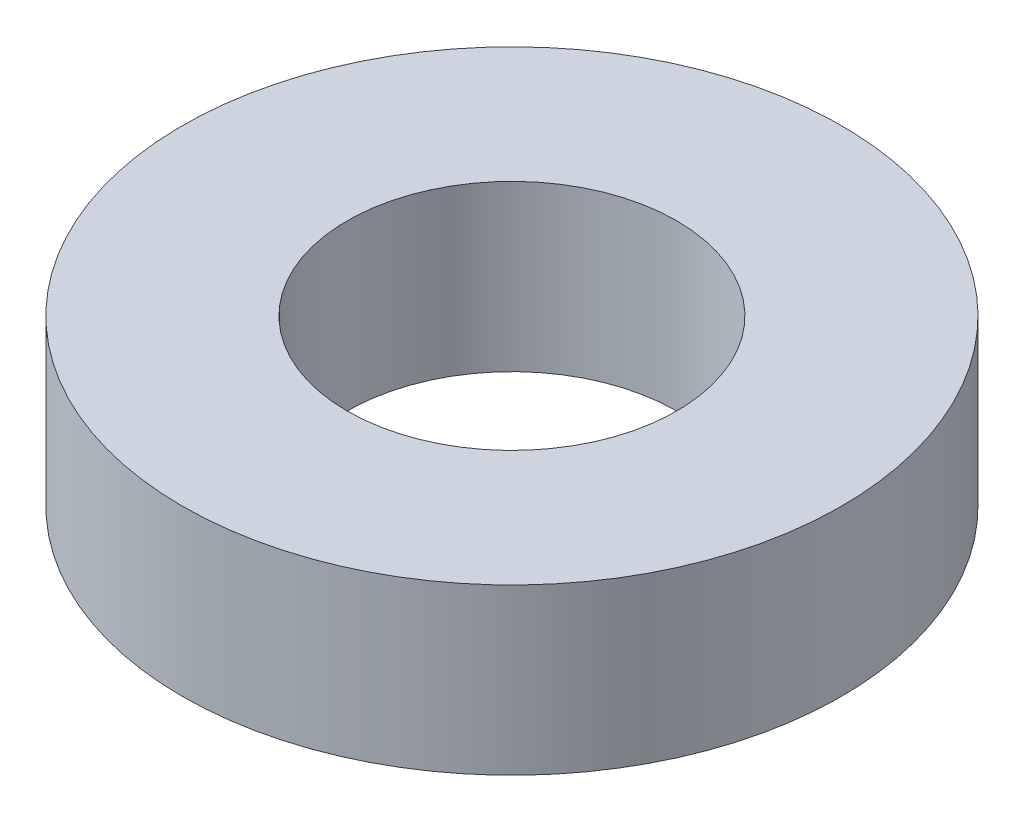
ISO-10303-21;
HEADER;
FILE_DESCRIPTION(('STEP AP214'),'2;1');
FILE_NAME('part.step','',(''),(''),'','','');
FILE_SCHEMA(('AUTOMOTIVE_DESIGN { 1 0 10303 214 1 1 1 1 }'));
ENDSEC;
DATA;
#1=APPLICATION_CONTEXT('core data for automotive mechanical design processes');
#2=APPLICATION_PROTOCOL_DEFINITION('international standard','automotive_design',2000,#1);
#3=PRODUCT_CONTEXT('',#1,'mechanical');
#4=PRODUCT('Part','Part','',(#3));
#5=PRODUCT_RELATED_PRODUCT_CATEGORY('part','',(#4));
#6=PRODUCT_DEFINITION_FORMATION('','',#4);
#7=PRODUCT_DEFINITION_CONTEXT('part definition',#1,'design');
#8=PRODUCT_DEFINITION('design','',#6,#7);
#9=PRODUCT_DEFINITION_SHAPE('','',#8);
#10=(LENGTH_UNIT() NAMED_UNIT(*) SI_UNIT(.MILLI.,.METRE.));
#11=(NAMED_UNIT(*) PLANE_ANGLE_UNIT() SI_UNIT($,.RADIAN.));
#12=(NAMED_UNIT(*) SI_UNIT($,.STERADIAN.) SOLID_ANGLE_UNIT());
#13=UNCERTAINTY_MEASURE_WITH_UNIT(LENGTH_MEASURE(1.E-05),#10,'distance_accuracy_value','');
#14=(GEOMETRIC_REPRESENTATION_CONTEXT(3) GLOBAL_UNCERTAINTY_ASSIGNED_CONTEXT((#13)) GLOBAL_UNIT_ASSIGNED_CONTEXT((#10,
#11,#12)) REPRESENTATION_CONTEXT('',''));
#15=CARTESIAN_POINT('',(0.,0.,0.));
#16=DIRECTION('',(0.,0.,1.));
#17=DIRECTION('',(1.,0.,0.));
#18=AXIS2_PLACEMENT_3D('',#15,#16,#17);
#19=CARTESIAN_POINT('',(0.,1.,0.));
#20=DIRECTION('',(0.,1.,0.));
#21=DIRECTION('',(0.,0.,1.));
#22=AXIS2_PLACEMENT_3D('',#19,#20,#21);
#23=PLANE('',#22);
#24=CARTESIAN_POINT('',(0.,1.,0.));
#25=DIRECTION('',(0.,1.,0.));
#26=DIRECTION('',(0.,0.,1.));
#27=AXIS2_PLACEMENT_3D('',#24,#25,#26);
#28=CIRCLE('',#27,4.);
#29=CARTESIAN_POINT('',(0.,1.,4.));
#30=VERTEX_POINT('',#29);
#31=EDGE_CURVE('E10',#30,#30,#28,.T.);
#32=ORIENTED_EDGE('',*,*,#31,.T.);
#33=EDGE_LOOP('',(#32));
#34=FACE_BOUND('',#33,.T.);
#35=CARTESIAN_POINT('',(0.,1.,0.));
#36=DIRECTION('',(0.,1.,0.));
#37=DIRECTION('',(0.,0.,1.));
#38=AXIS2_PLACEMENT_3D('',#35,#36,#37);
#39=CIRCLE('',#38,2.);
#40=CARTESIAN_POINT('',(0.,1.,2.));
#41=VERTEX_POINT('',#40);
#42=EDGE_CURVE('E50',#41,#41,#39,.T.);
#43=ORIENTED_EDGE('',*,*,#42,.F.);
#44=EDGE_LOOP('',(#43));
#45=FACE_BOUND('',#44,.T.);
#46=ADVANCED_FACE('F37',(#34,#45),#23,.T.);
#47=CARTESIAN_POINT('',(0.,-1.,0.));
#48=DIRECTION('',(0.,1.,0.));
#49=DIRECTION('',(0.,0.,1.));
#50=AXIS2_PLACEMENT_3D('',#47,#48,#49);
#51=PLANE('',#50);
#52=CARTESIAN_POINT('',(0.,-1.,0.));
#53=DIRECTION('',(0.,1.,0.));
#54=DIRECTION('',(0.,0.,1.));
#55=AXIS2_PLACEMENT_3D('',#52,#53,#54);
#56=CIRCLE('',#55,4.);
#57=CARTESIAN_POINT('',(0.,-1.,4.));
#58=VERTEX_POINT('',#57);
#59=EDGE_CURVE('E41',#58,#58,#56,.T.);
#60=ORIENTED_EDGE('',*,*,#59,.F.);
#61=EDGE_LOOP('',(#60));
#62=FACE_BOUND('',#61,.T.);
#63=CARTESIAN_POINT('',(0.,-1.,0.));
#64=DIRECTION('',(0.,1.,0.));
#65=DIRECTION('',(0.,0.,1.));
#66=AXIS2_PLACEMENT_3D('',#63,#64,#65);
#67=CIRCLE('',#66,2.);
#68=CARTESIAN_POINT('',(0.,-1.,2.));
#69=VERTEX_POINT('',#68);
#70=EDGE_CURVE('E52',#69,#69,#67,.T.);
#71=ORIENTED_EDGE('',*,*,#70,.T.);
#72=EDGE_LOOP('',(#71));
#73=FACE_BOUND('',#72,.T.);
#74=ADVANCED_FACE('F64',(#62,#73),#51,.F.);
#75=CARTESIAN_POINT('',(0.,1.,0.));
#76=DIRECTION('',(0.,-1.,0.));
#77=DIRECTION('',(0.,0.,-1.));
#78=AXIS2_PLACEMENT_3D('',#75,#76,#77);
#79=CYLINDRICAL_SURFACE('',#78,4.);
#80=ORIENTED_EDGE('',*,*,#31,.F.);
#81=EDGE_LOOP('',(#80));
#82=FACE_BOUND('',#81,.T.);
#83=ORIENTED_EDGE('',*,*,#59,.T.);
#84=EDGE_LOOP('',(#83));
#85=FACE_BOUND('',#84,.T.);
#86=ADVANCED_FACE('F39',(#82,#85),#79,.T.);
#87=CARTESIAN_POINT('',(0.,1.,0.));
#88=DIRECTION('',(0.,-1.,0.));
#89=DIRECTION('',(0.,0.,-1.));
#90=AXIS2_PLACEMENT_3D('',#87,#88,#89);
#91=CYLINDRICAL_SURFACE('',#90,2.);
#92=ORIENTED_EDGE('',*,*,#42,.T.);
#93=EDGE_LOOP('',(#92));
#94=FACE_BOUND('',#93,.T.);
#95=ORIENTED_EDGE('',*,*,#70,.F.);
#96=EDGE_LOOP('',(#95));
#97=FACE_BOUND('',#96,.T.);
#98=ADVANCED_FACE('F60',(#94,#97),#91,.F.);
#99=CLOSED_SHELL('',(#46,#74,#86,#98));
#100=MANIFOLD_SOLID_BREP('B2',#99);
#101=ADVANCED_BREP_SHAPE_REPRESENTATION('',(#18,#100),#14);
#102=SHAPE_DEFINITION_REPRESENTATION(#9,#101);
ENDSEC;
END-ISO-10303-21;
